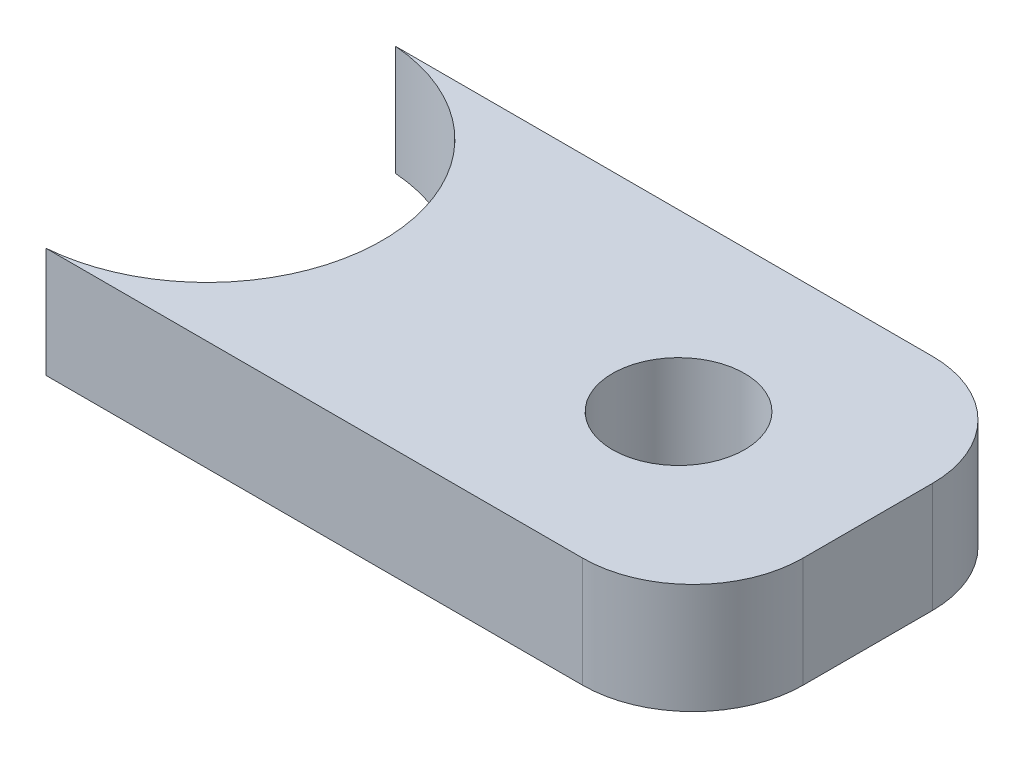
ISO-10303-21;
HEADER;
FILE_DESCRIPTION(('STEP AP214'),'2;1');
FILE_NAME('part.step','',(''),(''),'','','');
FILE_SCHEMA(('AUTOMOTIVE_DESIGN { 1 0 10303 214 1 1 1 1 }'));
ENDSEC;
DATA;
#1=APPLICATION_CONTEXT('core data for automotive mechanical design processes');
#2=APPLICATION_PROTOCOL_DEFINITION('international standard','automotive_design',2000,#1);
#3=PRODUCT_CONTEXT('',#1,'mechanical');
#4=PRODUCT('Part','Part','',(#3));
#5=PRODUCT_RELATED_PRODUCT_CATEGORY('part','',(#4));
#6=PRODUCT_DEFINITION_FORMATION('','',#4);
#7=PRODUCT_DEFINITION_CONTEXT('part definition',#1,'design');
#8=PRODUCT_DEFINITION('design','',#6,#7);
#9=PRODUCT_DEFINITION_SHAPE('','',#8);
#10=(LENGTH_UNIT() NAMED_UNIT(*) SI_UNIT(.MILLI.,.METRE.));
#11=(NAMED_UNIT(*) PLANE_ANGLE_UNIT() SI_UNIT($,.RADIAN.));
#12=(NAMED_UNIT(*) SI_UNIT($,.STERADIAN.) SOLID_ANGLE_UNIT());
#13=UNCERTAINTY_MEASURE_WITH_UNIT(LENGTH_MEASURE(1.E-05),#10,'distance_accuracy_value','');
#14=(GEOMETRIC_REPRESENTATION_CONTEXT(3) GLOBAL_UNCERTAINTY_ASSIGNED_CONTEXT((#13)) GLOBAL_UNIT_ASSIGNED_CONTEXT((#10,
#11,#12)) REPRESENTATION_CONTEXT('',''));
#15=CARTESIAN_POINT('',(0.,0.,0.));
#16=DIRECTION('',(0.,0.,1.));
#17=DIRECTION('',(1.,0.,0.));
#18=AXIS2_PLACEMENT_3D('',#15,#16,#17);
#19=CARTESIAN_POINT('',(0.787399000000009,0.393701,-0.231299000000008));
#20=DIRECTION('',(0.,-1.,0.));
#21=DIRECTION('',(0.,0.,-1.));
#22=AXIS2_PLACEMENT_3D('',#19,#20,#21);
#23=CYLINDRICAL_SURFACE('',#22,0.393701);
#24=CARTESIAN_POINT('',(0.787399000000009,0.,-0.231299000000008));
#25=DIRECTION('',(0.,1.,0.));
#26=DIRECTION('',(0.,0.,1.));
#27=AXIS2_PLACEMENT_3D('',#24,#25,#26);
#28=CIRCLE('',#27,0.393701);
#29=CARTESIAN_POINT('',(0.787399000000006,0.,-0.625000000000008));
#30=VERTEX_POINT('',#29);
#31=CARTESIAN_POINT('',(1.18110000000001,0.,-0.231299000000003));
#32=VERTEX_POINT('',#31);
#33=EDGE_CURVE('E132',#30,#32,#28,.F.);
#34=ORIENTED_EDGE('',*,*,#33,.F.);
#35=DIRECTION('',(0.,-1.,0.));
#36=VECTOR('',#35,1.);
#37=CARTESIAN_POINT('',(0.787399000000006,0.393701,-0.625000000000008));
#38=LINE('',#37,#36);
#39=CARTESIAN_POINT('',(0.787399000000006,0.393701,-0.625000000000008));
#40=VERTEX_POINT('',#39);
#41=EDGE_CURVE('E11',#40,#30,#38,.T.);
#42=ORIENTED_EDGE('',*,*,#41,.F.);
#43=CARTESIAN_POINT('',(0.787399000000009,0.393701,-0.231299000000008));
#44=DIRECTION('',(0.,1.,0.));
#45=DIRECTION('',(0.,0.,1.));
#46=AXIS2_PLACEMENT_3D('',#43,#44,#45);
#47=CIRCLE('',#46,0.393701);
#48=CARTESIAN_POINT('',(1.18110000000001,0.393701,-0.231299000000003));
#49=VERTEX_POINT('',#48);
#50=EDGE_CURVE('E156',#40,#49,#47,.F.);
#51=ORIENTED_EDGE('',*,*,#50,.T.);
#52=DIRECTION('',(0.,-1.,0.));
#53=VECTOR('',#52,1.);
#54=CARTESIAN_POINT('',(1.18110000000001,0.393701,-0.231299000000003));
#55=LINE('',#54,#53);
#56=EDGE_CURVE('E58',#49,#32,#55,.T.);
#57=ORIENTED_EDGE('',*,*,#56,.T.);
#58=EDGE_LOOP('',(#34,#42,#51,#57));
#59=FACE_BOUND('',#58,.T.);
#60=ADVANCED_FACE('F41',(#59),#23,.T.);
#61=CARTESIAN_POINT('',(0.,0.393701,-0.625000000000008));
#62=DIRECTION('',(0.,0.,-1.));
#63=DIRECTION('',(-1.,0.,0.));
#64=AXIS2_PLACEMENT_3D('',#61,#62,#63);
#65=PLANE('',#64);
#66=DIRECTION('',(1.,0.,0.));
#67=VECTOR('',#66,1.);
#68=CARTESIAN_POINT('',(0.,0.,-0.625000000000008));
#69=LINE('',#68,#67);
#70=CARTESIAN_POINT('',(-1.13109177420011,0.,-0.625000000000008));
#71=VERTEX_POINT('',#70);
#72=EDGE_CURVE('E135',#71,#30,#69,.T.);
#73=ORIENTED_EDGE('',*,*,#72,.F.);
#74=DIRECTION('',(0.,-1.,0.));
#75=VECTOR('',#74,1.);
#76=CARTESIAN_POINT('',(-1.13109177420011,0.393701,-0.625000000000008));
#77=LINE('',#76,#75);
#78=CARTESIAN_POINT('',(-1.13109177420011,0.393701,-0.625000000000008));
#79=VERTEX_POINT('',#78);
#80=EDGE_CURVE('E50',#79,#71,#77,.T.);
#81=ORIENTED_EDGE('',*,*,#80,.F.);
#82=DIRECTION('',(1.,0.,0.));
#83=VECTOR('',#82,1.);
#84=CARTESIAN_POINT('',(0.,0.393701,-0.625000000000008));
#85=LINE('',#84,#83);
#86=EDGE_CURVE('E249',#79,#40,#85,.T.);
#87=ORIENTED_EDGE('',*,*,#86,.T.);
#88=ORIENTED_EDGE('',*,*,#41,.T.);
#89=EDGE_LOOP('',(#73,#81,#87,#88));
#90=FACE_BOUND('',#89,.T.);
#91=ADVANCED_FACE('F169',(#90),#65,.T.);
#92=CARTESIAN_POINT('',(-1.18109999999999,0.393701,0.));
#93=DIRECTION('',(0.,-1.,0.));
#94=DIRECTION('',(0.,0.,-1.));
#95=AXIS2_PLACEMENT_3D('',#92,#93,#94);
#96=CYLINDRICAL_SURFACE('',#95,0.626997466221078);
#97=CARTESIAN_POINT('',(-1.18109999999999,0.,0.));
#98=DIRECTION('',(0.,1.,0.));
#99=DIRECTION('',(0.,0.,1.));
#100=AXIS2_PLACEMENT_3D('',#97,#98,#99);
#101=CIRCLE('',#100,0.626997466221078);
#102=CARTESIAN_POINT('',(-1.13109177420011,0.,0.624999999999994));
#103=VERTEX_POINT('',#102);
#104=EDGE_CURVE('E139',#103,#71,#101,.T.);
#105=ORIENTED_EDGE('',*,*,#104,.F.);
#106=DIRECTION('',(0.,-1.,0.));
#107=VECTOR('',#106,1.);
#108=CARTESIAN_POINT('',(-1.13109177420011,0.393701,0.624999999999994));
#109=LINE('',#108,#107);
#110=CARTESIAN_POINT('',(-1.13109177420011,0.393701,0.624999999999994));
#111=VERTEX_POINT('',#110);
#112=EDGE_CURVE('E118',#111,#103,#109,.T.);
#113=ORIENTED_EDGE('',*,*,#112,.F.);
#114=CARTESIAN_POINT('',(-1.18109999999999,0.393701,0.));
#115=DIRECTION('',(0.,1.,0.));
#116=DIRECTION('',(0.,0.,1.));
#117=AXIS2_PLACEMENT_3D('',#114,#115,#116);
#118=CIRCLE('',#117,0.626997466221078);
#119=EDGE_CURVE('E106',#111,#79,#118,.T.);
#120=ORIENTED_EDGE('',*,*,#119,.T.);
#121=ORIENTED_EDGE('',*,*,#80,.T.);
#122=EDGE_LOOP('',(#105,#113,#120,#121));
#123=FACE_BOUND('',#122,.T.);
#124=ADVANCED_FACE('F166',(#123),#96,.F.);
#125=CARTESIAN_POINT('',(0.,0.393701,0.624999999999994));
#126=DIRECTION('',(0.,0.,-1.));
#127=DIRECTION('',(-1.,0.,0.));
#128=AXIS2_PLACEMENT_3D('',#125,#126,#127);
#129=PLANE('',#128);
#130=DIRECTION('',(1.,0.,0.));
#131=VECTOR('',#130,1.);
#132=CARTESIAN_POINT('',(0.,0.,0.624999999999994));
#133=LINE('',#132,#131);
#134=CARTESIAN_POINT('',(0.787399000000004,0.,0.624999999999994));
#135=VERTEX_POINT('',#134);
#136=EDGE_CURVE('E114',#103,#135,#133,.T.);
#137=ORIENTED_EDGE('',*,*,#136,.T.);
#138=DIRECTION('',(0.,-1.,0.));
#139=VECTOR('',#138,1.);
#140=CARTESIAN_POINT('',(0.787399000000004,0.393701,0.624999999999994));
#141=LINE('',#140,#139);
#142=CARTESIAN_POINT('',(0.787399000000004,0.393701,0.624999999999994));
#143=VERTEX_POINT('',#142);
#144=EDGE_CURVE('E111',#143,#135,#141,.T.);
#145=ORIENTED_EDGE('',*,*,#144,.F.);
#146=DIRECTION('',(1.,0.,0.));
#147=VECTOR('',#146,1.);
#148=CARTESIAN_POINT('',(0.,0.393701,0.624999999999994));
#149=LINE('',#148,#147);
#150=EDGE_CURVE('E97',#111,#143,#149,.T.);
#151=ORIENTED_EDGE('',*,*,#150,.F.);
#152=ORIENTED_EDGE('',*,*,#112,.T.);
#153=EDGE_LOOP('',(#137,#145,#151,#152));
#154=FACE_BOUND('',#153,.T.);
#155=ADVANCED_FACE('F112',(#154),#129,.F.);
#156=CARTESIAN_POINT('',(0.787399000000006,0.393701,0.231298999999994));
#157=DIRECTION('',(0.,-1.,0.));
#158=DIRECTION('',(0.,0.,-1.));
#159=AXIS2_PLACEMENT_3D('',#156,#157,#158);
#160=CYLINDRICAL_SURFACE('',#159,0.393701);
#161=CARTESIAN_POINT('',(0.787399000000006,0.,0.231298999999994));
#162=DIRECTION('',(0.,1.,0.));
#163=DIRECTION('',(0.,0.,1.));
#164=AXIS2_PLACEMENT_3D('',#161,#162,#163);
#165=CIRCLE('',#164,0.393701);
#166=CARTESIAN_POINT('',(1.18110000000001,0.,0.231298999999993));
#167=VERTEX_POINT('',#166);
#168=EDGE_CURVE('E145',#135,#167,#165,.T.);
#169=ORIENTED_EDGE('',*,*,#168,.T.);
#170=DIRECTION('',(0.,-1.,0.));
#171=VECTOR('',#170,1.);
#172=CARTESIAN_POINT('',(1.18110000000001,0.393701,0.231298999999993));
#173=LINE('',#172,#171);
#174=CARTESIAN_POINT('',(1.18110000000001,0.393701,0.231298999999993));
#175=VERTEX_POINT('',#174);
#176=EDGE_CURVE('E78',#175,#167,#173,.T.);
#177=ORIENTED_EDGE('',*,*,#176,.F.);
#178=CARTESIAN_POINT('',(0.787399000000006,0.393701,0.231298999999994));
#179=DIRECTION('',(0.,1.,0.));
#180=DIRECTION('',(0.,0.,1.));
#181=AXIS2_PLACEMENT_3D('',#178,#179,#180);
#182=CIRCLE('',#181,0.393701);
#183=EDGE_CURVE('E103',#143,#175,#182,.T.);
#184=ORIENTED_EDGE('',*,*,#183,.F.);
#185=ORIENTED_EDGE('',*,*,#144,.T.);
#186=EDGE_LOOP('',(#169,#177,#184,#185));
#187=FACE_BOUND('',#186,.T.);
#188=ADVANCED_FACE('F120',(#187),#160,.T.);
#189=CARTESIAN_POINT('',(1.18110000000001,0.393701,0.));
#190=DIRECTION('',(1.,0.,0.));
#191=DIRECTION('',(0.,0.,-1.));
#192=AXIS2_PLACEMENT_3D('',#189,#190,#191);
#193=PLANE('',#192);
#194=DIRECTION('',(0.,0.,1.));
#195=VECTOR('',#194,1.);
#196=CARTESIAN_POINT('',(1.18110000000001,0.,0.));
#197=LINE('',#196,#195);
#198=EDGE_CURVE('E148',#32,#167,#197,.T.);
#199=ORIENTED_EDGE('',*,*,#198,.F.);
#200=ORIENTED_EDGE('',*,*,#56,.F.);
#201=DIRECTION('',(0.,0.,1.));
#202=VECTOR('',#201,1.);
#203=CARTESIAN_POINT('',(1.18110000000001,0.393701,0.));
#204=LINE('',#203,#202);
#205=EDGE_CURVE('E122',#49,#175,#204,.T.);
#206=ORIENTED_EDGE('',*,*,#205,.T.);
#207=ORIENTED_EDGE('',*,*,#176,.T.);
#208=EDGE_LOOP('',(#199,#200,#206,#207));
#209=FACE_BOUND('',#208,.T.);
#210=ADVANCED_FACE('F173',(#209),#193,.T.);
#211=CARTESIAN_POINT('',(0.505047652323313,0.393701,0.));
#212=DIRECTION('',(0.,-1.,0.));
#213=DIRECTION('',(0.,0.,-1.));
#214=AXIS2_PLACEMENT_3D('',#211,#212,#213);
#215=CYLINDRICAL_SURFACE('',#214,0.2362205);
#216=CARTESIAN_POINT('',(0.505047652323313,0.393701,0.));
#217=DIRECTION('',(0.,1.,0.));
#218=DIRECTION('',(0.,0.,1.));
#219=AXIS2_PLACEMENT_3D('',#216,#217,#218);
#220=CIRCLE('',#219,0.2362205);
#221=CARTESIAN_POINT('',(0.505047652323313,0.393701,0.236220499999993));
#222=VERTEX_POINT('',#221);
#223=EDGE_CURVE('E125',#222,#222,#220,.T.);
#224=ORIENTED_EDGE('',*,*,#223,.T.);
#225=EDGE_LOOP('',(#224));
#226=FACE_BOUND('',#225,.T.);
#227=CARTESIAN_POINT('',(0.505047652323313,0.,0.));
#228=DIRECTION('',(0.,1.,0.));
#229=DIRECTION('',(0.,0.,1.));
#230=AXIS2_PLACEMENT_3D('',#227,#228,#229);
#231=CIRCLE('',#230,0.2362205);
#232=CARTESIAN_POINT('',(0.505047652323313,0.,0.236220499999993));
#233=VERTEX_POINT('',#232);
#234=EDGE_CURVE('E152',#233,#233,#231,.T.);
#235=ORIENTED_EDGE('',*,*,#234,.F.);
#236=EDGE_LOOP('',(#235));
#237=FACE_BOUND('',#236,.T.);
#238=ADVANCED_FACE('F175',(#226,#237),#215,.F.);
#239=CARTESIAN_POINT('',(0.,0.393701,0.));
#240=DIRECTION('',(0.,1.,0.));
#241=DIRECTION('',(0.,0.,1.));
#242=AXIS2_PLACEMENT_3D('',#239,#240,#241);
#243=PLANE('',#242);
#244=ORIENTED_EDGE('',*,*,#50,.F.);
#245=ORIENTED_EDGE('',*,*,#86,.F.);
#246=ORIENTED_EDGE('',*,*,#119,.F.);
#247=ORIENTED_EDGE('',*,*,#150,.T.);
#248=ORIENTED_EDGE('',*,*,#183,.T.);
#249=ORIENTED_EDGE('',*,*,#205,.F.);
#250=EDGE_LOOP('',(#244,#245,#246,#247,#248,#249));
#251=FACE_BOUND('',#250,.T.);
#252=ORIENTED_EDGE('',*,*,#223,.F.);
#253=EDGE_LOOP('',(#252));
#254=FACE_BOUND('',#253,.T.);
#255=ADVANCED_FACE('F99',(#251,#254),#243,.T.);
#256=CARTESIAN_POINT('',(0.,0.,0.));
#257=DIRECTION('',(0.,1.,0.));
#258=DIRECTION('',(0.,0.,1.));
#259=AXIS2_PLACEMENT_3D('',#256,#257,#258);
#260=PLANE('',#259);
#261=ORIENTED_EDGE('',*,*,#33,.T.);
#262=ORIENTED_EDGE('',*,*,#198,.T.);
#263=ORIENTED_EDGE('',*,*,#168,.F.);
#264=ORIENTED_EDGE('',*,*,#136,.F.);
#265=ORIENTED_EDGE('',*,*,#104,.T.);
#266=ORIENTED_EDGE('',*,*,#72,.T.);
#267=EDGE_LOOP('',(#261,#262,#263,#264,#265,#266));
#268=FACE_BOUND('',#267,.T.);
#269=ORIENTED_EDGE('',*,*,#234,.T.);
#270=EDGE_LOOP('',(#269));
#271=FACE_BOUND('',#270,.T.);
#272=ADVANCED_FACE('F171',(#268,#271),#260,.F.);
#273=CLOSED_SHELL('',(#60,#91,#124,#155,#188,#210,#238,#255,#272));
#274=MANIFOLD_SOLID_BREP('B2',#273);
#275=ADVANCED_BREP_SHAPE_REPRESENTATION('',(#18,#274),#14);
#276=SHAPE_DEFINITION_REPRESENTATION(#9,#275);
ENDSEC;
END-ISO-10303-21;
